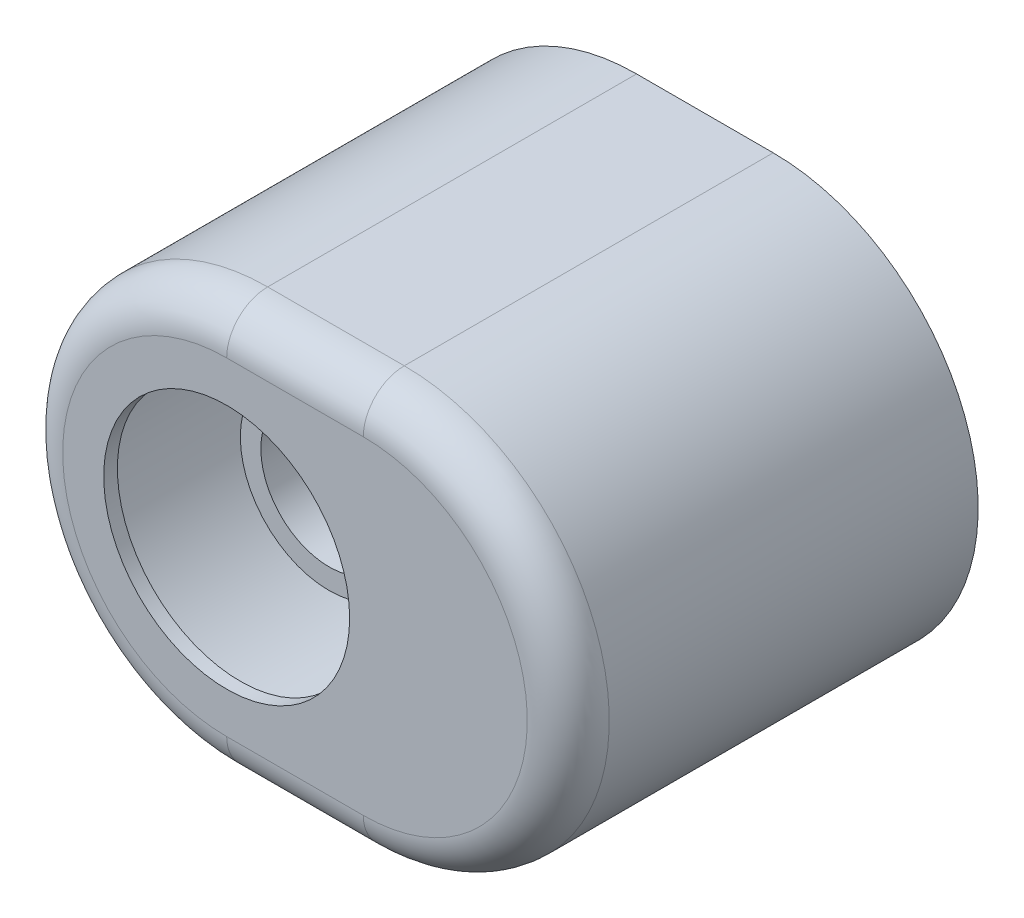
ISO-10303-21;
HEADER;
FILE_DESCRIPTION(('STEP AP214'),'2;1');
FILE_NAME('part.step','',(''),(''),'','','');
FILE_SCHEMA(('AUTOMOTIVE_DESIGN { 1 0 10303 214 1 1 1 1 }'));
ENDSEC;
DATA;
#1=APPLICATION_CONTEXT('core data for automotive mechanical design processes');
#2=APPLICATION_PROTOCOL_DEFINITION('international standard','automotive_design',2000,#1);
#3=PRODUCT_CONTEXT('',#1,'mechanical');
#4=PRODUCT('Part','Part','',(#3));
#5=PRODUCT_RELATED_PRODUCT_CATEGORY('part','',(#4));
#6=PRODUCT_DEFINITION_FORMATION('','',#4);
#7=PRODUCT_DEFINITION_CONTEXT('part definition',#1,'design');
#8=PRODUCT_DEFINITION('design','',#6,#7);
#9=PRODUCT_DEFINITION_SHAPE('','',#8);
#10=(LENGTH_UNIT() NAMED_UNIT(*) SI_UNIT(.MILLI.,.METRE.));
#11=(NAMED_UNIT(*) PLANE_ANGLE_UNIT() SI_UNIT($,.RADIAN.));
#12=(NAMED_UNIT(*) SI_UNIT($,.STERADIAN.) SOLID_ANGLE_UNIT());
#13=UNCERTAINTY_MEASURE_WITH_UNIT(LENGTH_MEASURE(1.E-05),#10,'distance_accuracy_value','');
#14=(GEOMETRIC_REPRESENTATION_CONTEXT(3) GLOBAL_UNCERTAINTY_ASSIGNED_CONTEXT((#13)) GLOBAL_UNIT_ASSIGNED_CONTEXT((#10,
#11,#12)) REPRESENTATION_CONTEXT('',''));
#15=CARTESIAN_POINT('',(0.,0.,0.));
#16=DIRECTION('',(0.,0.,1.));
#17=DIRECTION('',(1.,0.,0.));
#18=AXIS2_PLACEMENT_3D('',#15,#16,#17);
#19=CARTESIAN_POINT('',(-23.,0.,45.));
#20=DIRECTION('',(0.,0.,1.));
#21=DIRECTION('',(1.,0.,0.));
#22=AXIS2_PLACEMENT_3D('',#19,#20,#21);
#23=PLANE('',#22);
#24=CARTESIAN_POINT('',(-10.,0.,45.));
#25=DIRECTION('',(0.,0.,-1.));
#26=DIRECTION('',(-1.,0.,0.));
#27=AXIS2_PLACEMENT_3D('',#24,#25,#26);
#28=CIRCLE('',#27,9.99999999999999);
#29=CARTESIAN_POINT('',(-20.,0.,45.));
#30=VERTEX_POINT('',#29);
#31=EDGE_CURVE('E11',#30,#30,#28,.T.);
#32=ORIENTED_EDGE('',*,*,#31,.T.);
#33=EDGE_LOOP('',(#32));
#34=FACE_BOUND('',#33,.T.);
#35=CARTESIAN_POINT('',(-10.,0.,45.));
#36=DIRECTION('',(0.,0.,-1.));
#37=DIRECTION('',(-1.,0.,0.));
#38=AXIS2_PLACEMENT_3D('',#35,#36,#37);
#39=CIRCLE('',#38,13.);
#40=CARTESIAN_POINT('',(-23.,0.,45.));
#41=VERTEX_POINT('',#40);
#42=EDGE_CURVE('E87',#41,#41,#39,.T.);
#43=ORIENTED_EDGE('',*,*,#42,.F.);
#44=EDGE_LOOP('',(#43));
#45=FACE_BOUND('',#44,.T.);
#46=ADVANCED_FACE('F47',(#34,#45),#23,.T.);
#47=CARTESIAN_POINT('',(-10.,0.,0.));
#48=DIRECTION('',(0.,0.,-1.));
#49=DIRECTION('',(-1.,0.,0.));
#50=AXIS2_PLACEMENT_3D('',#47,#48,#49);
#51=CYLINDRICAL_SURFACE('',#50,9.99999999999999);
#52=CARTESIAN_POINT('',(-10.,0.,39.));
#53=DIRECTION('',(0.,0.,-1.));
#54=DIRECTION('',(-1.,0.,0.));
#55=AXIS2_PLACEMENT_3D('',#52,#53,#54);
#56=CIRCLE('',#55,9.99999999999999);
#57=CARTESIAN_POINT('',(-20.,0.,39.));
#58=VERTEX_POINT('',#57);
#59=EDGE_CURVE('E53',#58,#58,#56,.T.);
#60=ORIENTED_EDGE('',*,*,#59,.T.);
#61=EDGE_LOOP('',(#60));
#62=FACE_BOUND('',#61,.T.);
#63=ORIENTED_EDGE('',*,*,#31,.F.);
#64=EDGE_LOOP('',(#63));
#65=FACE_BOUND('',#64,.T.);
#66=ADVANCED_FACE('F95',(#62,#65),#51,.F.);
#67=CARTESIAN_POINT('',(-20.,0.,39.));
#68=DIRECTION('',(0.,0.,1.));
#69=DIRECTION('',(1.,0.,0.));
#70=AXIS2_PLACEMENT_3D('',#67,#68,#69);
#71=PLANE('',#70);
#72=CARTESIAN_POINT('',(-10.,0.,39.));
#73=DIRECTION('',(0.,0.,-1.));
#74=DIRECTION('',(-1.,0.,0.));
#75=AXIS2_PLACEMENT_3D('',#72,#73,#74);
#76=CIRCLE('',#75,7.99999999999999);
#77=CARTESIAN_POINT('',(-18.,0.,39.));
#78=VERTEX_POINT('',#77);
#79=EDGE_CURVE('E57',#78,#78,#76,.T.);
#80=ORIENTED_EDGE('',*,*,#79,.T.);
#81=EDGE_LOOP('',(#80));
#82=FACE_BOUND('',#81,.T.);
#83=ORIENTED_EDGE('',*,*,#59,.F.);
#84=EDGE_LOOP('',(#83));
#85=FACE_BOUND('',#84,.T.);
#86=ADVANCED_FACE('F99',(#82,#85),#71,.T.);
#87=CARTESIAN_POINT('',(-10.,0.,0.));
#88=DIRECTION('',(0.,0.,-1.));
#89=DIRECTION('',(-1.,0.,0.));
#90=AXIS2_PLACEMENT_3D('',#87,#88,#89);
#91=CYLINDRICAL_SURFACE('',#90,7.99999999999999);
#92=CARTESIAN_POINT('',(-10.,0.,37.));
#93=DIRECTION('',(0.,0.,-1.));
#94=DIRECTION('',(-1.,0.,0.));
#95=AXIS2_PLACEMENT_3D('',#92,#93,#94);
#96=CIRCLE('',#95,7.99999999999999);
#97=CARTESIAN_POINT('',(-18.,0.,37.));
#98=VERTEX_POINT('',#97);
#99=EDGE_CURVE('E61',#98,#98,#96,.T.);
#100=ORIENTED_EDGE('',*,*,#99,.T.);
#101=EDGE_LOOP('',(#100));
#102=FACE_BOUND('',#101,.T.);
#103=ORIENTED_EDGE('',*,*,#79,.F.);
#104=EDGE_LOOP('',(#103));
#105=FACE_BOUND('',#104,.T.);
#106=ADVANCED_FACE('F103',(#102,#105),#91,.F.);
#107=CARTESIAN_POINT('',(-10.,0.,37.));
#108=DIRECTION('',(0.,0.,1.));
#109=DIRECTION('',(1.,0.,0.));
#110=AXIS2_PLACEMENT_3D('',#107,#108,#109);
#111=CONICAL_SURFACE('',#110,7.99999999999999,0.528074448426359);
#112=CARTESIAN_POINT('',(-10.,0.,31.));
#113=DIRECTION('',(0.,0.,-1.));
#114=DIRECTION('',(-1.,0.,0.));
#115=AXIS2_PLACEMENT_3D('',#112,#113,#114);
#116=CIRCLE('',#115,4.5);
#117=CARTESIAN_POINT('',(-14.5,0.,31.));
#118=VERTEX_POINT('',#117);
#119=EDGE_CURVE('E66',#118,#118,#116,.T.);
#120=ORIENTED_EDGE('',*,*,#119,.T.);
#121=EDGE_LOOP('',(#120));
#122=FACE_BOUND('',#121,.T.);
#123=ORIENTED_EDGE('',*,*,#99,.F.);
#124=EDGE_LOOP('',(#123));
#125=FACE_BOUND('',#124,.T.);
#126=ADVANCED_FACE('F110',(#122,#125),#111,.F.);
#127=CARTESIAN_POINT('',(-10.,0.,0.));
#128=DIRECTION('',(0.,0.,-1.));
#129=DIRECTION('',(-1.,0.,0.));
#130=AXIS2_PLACEMENT_3D('',#127,#128,#129);
#131=CYLINDRICAL_SURFACE('',#130,4.5);
#132=CARTESIAN_POINT('',(-10.,0.,29.));
#133=DIRECTION('',(0.,0.,-1.));
#134=DIRECTION('',(-1.,0.,0.));
#135=AXIS2_PLACEMENT_3D('',#132,#133,#134);
#136=CIRCLE('',#135,4.5);
#137=CARTESIAN_POINT('',(-14.5,0.,29.));
#138=VERTEX_POINT('',#137);
#139=EDGE_CURVE('E69',#138,#138,#136,.T.);
#140=ORIENTED_EDGE('',*,*,#139,.T.);
#141=EDGE_LOOP('',(#140));
#142=FACE_BOUND('',#141,.T.);
#143=ORIENTED_EDGE('',*,*,#119,.F.);
#144=EDGE_LOOP('',(#143));
#145=FACE_BOUND('',#144,.T.);
#146=ADVANCED_FACE('F114',(#142,#145),#131,.F.);
#147=CARTESIAN_POINT('',(-14.5,0.,29.));
#148=DIRECTION('',(0.,0.,-1.));
#149=DIRECTION('',(-1.,0.,0.));
#150=AXIS2_PLACEMENT_3D('',#147,#148,#149);
#151=PLANE('',#150);
#152=CARTESIAN_POINT('',(-10.,0.,29.));
#153=DIRECTION('',(0.,0.,-1.));
#154=DIRECTION('',(-1.,0.,0.));
#155=AXIS2_PLACEMENT_3D('',#152,#153,#154);
#156=CIRCLE('',#155,6.5);
#157=CARTESIAN_POINT('',(-16.5,0.,29.));
#158=VERTEX_POINT('',#157);
#159=EDGE_CURVE('E72',#158,#158,#156,.T.);
#160=ORIENTED_EDGE('',*,*,#159,.T.);
#161=EDGE_LOOP('',(#160));
#162=FACE_BOUND('',#161,.T.);
#163=ORIENTED_EDGE('',*,*,#139,.F.);
#164=EDGE_LOOP('',(#163));
#165=FACE_BOUND('',#164,.T.);
#166=ADVANCED_FACE('F118',(#162,#165),#151,.T.);
#167=CARTESIAN_POINT('',(-10.,0.,0.));
#168=DIRECTION('',(0.,0.,-1.));
#169=DIRECTION('',(-1.,0.,0.));
#170=AXIS2_PLACEMENT_3D('',#167,#168,#169);
#171=CYLINDRICAL_SURFACE('',#170,6.5);
#172=CARTESIAN_POINT('',(-10.,0.,25.));
#173=DIRECTION('',(0.,0.,-1.));
#174=DIRECTION('',(-1.,0.,0.));
#175=AXIS2_PLACEMENT_3D('',#172,#173,#174);
#176=CIRCLE('',#175,6.5);
#177=CARTESIAN_POINT('',(-16.5,0.,25.));
#178=VERTEX_POINT('',#177);
#179=EDGE_CURVE('E75',#178,#178,#176,.T.);
#180=ORIENTED_EDGE('',*,*,#179,.T.);
#181=EDGE_LOOP('',(#180));
#182=FACE_BOUND('',#181,.T.);
#183=ORIENTED_EDGE('',*,*,#159,.F.);
#184=EDGE_LOOP('',(#183));
#185=FACE_BOUND('',#184,.T.);
#186=ADVANCED_FACE('F122',(#182,#185),#171,.F.);
#187=CARTESIAN_POINT('',(-16.5,0.,25.));
#188=DIRECTION('',(0.,0.,-1.));
#189=DIRECTION('',(-1.,0.,0.));
#190=AXIS2_PLACEMENT_3D('',#187,#188,#189);
#191=PLANE('',#190);
#192=CARTESIAN_POINT('',(-10.,0.,25.));
#193=DIRECTION('',(0.,0.,-1.));
#194=DIRECTION('',(-1.,0.,0.));
#195=AXIS2_PLACEMENT_3D('',#192,#193,#194);
#196=CIRCLE('',#195,9.49999999999999);
#197=CARTESIAN_POINT('',(-19.5,0.,25.));
#198=VERTEX_POINT('',#197);
#199=EDGE_CURVE('E78',#198,#198,#196,.T.);
#200=ORIENTED_EDGE('',*,*,#199,.T.);
#201=EDGE_LOOP('',(#200));
#202=FACE_BOUND('',#201,.T.);
#203=ORIENTED_EDGE('',*,*,#179,.F.);
#204=EDGE_LOOP('',(#203));
#205=FACE_BOUND('',#204,.T.);
#206=ADVANCED_FACE('F126',(#202,#205),#191,.T.);
#207=CARTESIAN_POINT('',(-10.,0.,0.));
#208=DIRECTION('',(0.,0.,-1.));
#209=DIRECTION('',(-1.,0.,0.));
#210=AXIS2_PLACEMENT_3D('',#207,#208,#209);
#211=CYLINDRICAL_SURFACE('',#210,9.49999999999999);
#212=CARTESIAN_POINT('',(-10.,0.,31.6328891488858));
#213=DIRECTION('',(0.,0.,-1.));
#214=DIRECTION('',(-1.,0.,0.));
#215=AXIS2_PLACEMENT_3D('',#212,#213,#214);
#216=CIRCLE('',#215,9.49999999999999);
#217=CARTESIAN_POINT('',(-19.5,0.,31.6328891488858));
#218=VERTEX_POINT('',#217);
#219=EDGE_CURVE('E81',#218,#218,#216,.T.);
#220=ORIENTED_EDGE('',*,*,#219,.T.);
#221=EDGE_LOOP('',(#220));
#222=FACE_BOUND('',#221,.T.);
#223=ORIENTED_EDGE('',*,*,#199,.F.);
#224=EDGE_LOOP('',(#223));
#225=FACE_BOUND('',#224,.T.);
#226=ADVANCED_FACE('F130',(#222,#225),#211,.T.);
#227=CARTESIAN_POINT('',(-10.,0.,31.6328891488858));
#228=DIRECTION('',(0.,0.,1.));
#229=DIRECTION('',(1.,0.,0.));
#230=AXIS2_PLACEMENT_3D('',#227,#228,#229);
#231=CONICAL_SURFACE('',#230,9.49999999999999,0.528074448426359);
#232=CARTESIAN_POINT('',(-10.,0.,37.6328891488859));
#233=DIRECTION('',(0.,0.,-1.));
#234=DIRECTION('',(-1.,0.,0.));
#235=AXIS2_PLACEMENT_3D('',#232,#233,#234);
#236=CIRCLE('',#235,13.);
#237=CARTESIAN_POINT('',(-23.,0.,37.6328891488859));
#238=VERTEX_POINT('',#237);
#239=EDGE_CURVE('E84',#238,#238,#236,.T.);
#240=ORIENTED_EDGE('',*,*,#239,.T.);
#241=EDGE_LOOP('',(#240));
#242=FACE_BOUND('',#241,.T.);
#243=ORIENTED_EDGE('',*,*,#219,.F.);
#244=EDGE_LOOP('',(#243));
#245=FACE_BOUND('',#244,.T.);
#246=ADVANCED_FACE('F134',(#242,#245),#231,.T.);
#247=CARTESIAN_POINT('',(-10.,0.,0.));
#248=DIRECTION('',(0.,0.,-1.));
#249=DIRECTION('',(-1.,0.,0.));
#250=AXIS2_PLACEMENT_3D('',#247,#248,#249);
#251=CYLINDRICAL_SURFACE('',#250,13.);
#252=ORIENTED_EDGE('',*,*,#42,.T.);
#253=EDGE_LOOP('',(#252));
#254=FACE_BOUND('',#253,.T.);
#255=ORIENTED_EDGE('',*,*,#239,.F.);
#256=EDGE_LOOP('',(#255));
#257=FACE_BOUND('',#256,.T.);
#258=ADVANCED_FACE('F91',(#254,#257),#251,.T.);
#259=CLOSED_SHELL('',(#46,#66,#86,#106,#126,#146,#166,#186,#206,#226,#246,#258));
#260=MANIFOLD_SOLID_BREP('B2',#259);
#261=CARTESIAN_POINT('',(-10.,0.,60.));
#262=DIRECTION('',(0.,0.,-1.));
#263=DIRECTION('',(-1.,0.,0.));
#264=AXIS2_PLACEMENT_3D('',#261,#262,#263);
#265=CYLINDRICAL_SURFACE('',#264,30.);
#266=DIRECTION('',(0.,0.,-1.));
#267=VECTOR('',#266,1.);
#268=CARTESIAN_POINT('',(-10.,-30.,60.));
#269=LINE('',#268,#267);
#270=CARTESIAN_POINT('',(-10.,-30.,54.));
#271=VERTEX_POINT('',#270);
#272=CARTESIAN_POINT('',(-10.,-30.,0.));
#273=VERTEX_POINT('',#272);
#274=EDGE_CURVE('E407',#271,#273,#269,.T.);
#275=ORIENTED_EDGE('',*,*,#274,.F.);
#276=CARTESIAN_POINT('',(-10.,0.,54.));
#277=DIRECTION('',(0.,0.,1.));
#278=DIRECTION('',(1.,0.,0.));
#279=AXIS2_PLACEMENT_3D('',#276,#277,#278);
#280=CIRCLE('',#279,30.);
#281=CARTESIAN_POINT('',(-10.,30.,54.));
#282=VERTEX_POINT('',#281);
#283=EDGE_CURVE('E45',#271,#282,#280,.F.);
#284=ORIENTED_EDGE('',*,*,#283,.T.);
#285=DIRECTION('',(0.,0.,-1.));
#286=VECTOR('',#285,1.);
#287=CARTESIAN_POINT('',(-10.,30.,60.));
#288=LINE('',#287,#286);
#289=CARTESIAN_POINT('',(-10.,30.,0.));
#290=VERTEX_POINT('',#289);
#291=EDGE_CURVE('E398',#282,#290,#288,.T.);
#292=ORIENTED_EDGE('',*,*,#291,.T.);
#293=CARTESIAN_POINT('',(-10.,0.,0.));
#294=DIRECTION('',(0.,0.,1.));
#295=DIRECTION('',(1.,0.,0.));
#296=AXIS2_PLACEMENT_3D('',#293,#294,#295);
#297=CIRCLE('',#296,30.);
#298=EDGE_CURVE('E381',#290,#273,#297,.T.);
#299=ORIENTED_EDGE('',*,*,#298,.T.);
#300=EDGE_LOOP('',(#275,#284,#292,#299));
#301=FACE_BOUND('',#300,.T.);
#302=ADVANCED_FACE('F228',(#301),#265,.T.);
#303=CARTESIAN_POINT('',(-10.,-30.,60.));
#304=DIRECTION('',(0.,1.,0.));
#305=DIRECTION('',(0.,0.,1.));
#306=AXIS2_PLACEMENT_3D('',#303,#304,#305);
#307=PLANE('',#306);
#308=DIRECTION('',(0.,0.,-1.));
#309=VECTOR('',#308,1.);
#310=CARTESIAN_POINT('',(10.,-30.,60.));
#311=LINE('',#310,#309);
#312=CARTESIAN_POINT('',(10.,-30.,54.));
#313=VERTEX_POINT('',#312);
#314=CARTESIAN_POINT('',(10.,-30.,0.));
#315=VERTEX_POINT('',#314);
#316=EDGE_CURVE('E404',#313,#315,#311,.T.);
#317=ORIENTED_EDGE('',*,*,#316,.F.);
#318=DIRECTION('',(1.,0.,0.));
#319=VECTOR('',#318,1.);
#320=CARTESIAN_POINT('',(-10.,-30.,54.));
#321=LINE('',#320,#319);
#322=EDGE_CURVE('E238',#313,#271,#321,.F.);
#323=ORIENTED_EDGE('',*,*,#322,.T.);
#324=ORIENTED_EDGE('',*,*,#274,.T.);
#325=DIRECTION('',(1.,0.,0.));
#326=VECTOR('',#325,1.);
#327=CARTESIAN_POINT('',(-10.,-30.,0.));
#328=LINE('',#327,#326);
#329=EDGE_CURVE('E385',#273,#315,#328,.T.);
#330=ORIENTED_EDGE('',*,*,#329,.T.);
#331=EDGE_LOOP('',(#317,#323,#324,#330));
#332=FACE_BOUND('',#331,.T.);
#333=ADVANCED_FACE('F484',(#332),#307,.F.);
#334=CARTESIAN_POINT('',(10.,0.,60.));
#335=DIRECTION('',(0.,0.,-1.));
#336=DIRECTION('',(-1.,0.,0.));
#337=AXIS2_PLACEMENT_3D('',#334,#335,#336);
#338=CYLINDRICAL_SURFACE('',#337,30.);
#339=DIRECTION('',(0.,0.,-1.));
#340=VECTOR('',#339,1.);
#341=CARTESIAN_POINT('',(10.,30.,60.));
#342=LINE('',#341,#340);
#343=CARTESIAN_POINT('',(10.,30.,54.));
#344=VERTEX_POINT('',#343);
#345=CARTESIAN_POINT('',(10.,30.,0.));
#346=VERTEX_POINT('',#345);
#347=EDGE_CURVE('E401',#344,#346,#342,.T.);
#348=ORIENTED_EDGE('',*,*,#347,.F.);
#349=CARTESIAN_POINT('',(10.,0.,54.));
#350=DIRECTION('',(0.,0.,1.));
#351=DIRECTION('',(1.,0.,0.));
#352=AXIS2_PLACEMENT_3D('',#349,#350,#351);
#353=CIRCLE('',#352,30.);
#354=EDGE_CURVE('E427',#344,#313,#353,.F.);
#355=ORIENTED_EDGE('',*,*,#354,.T.);
#356=ORIENTED_EDGE('',*,*,#316,.T.);
#357=CARTESIAN_POINT('',(10.,0.,0.));
#358=DIRECTION('',(0.,0.,1.));
#359=DIRECTION('',(1.,0.,0.));
#360=AXIS2_PLACEMENT_3D('',#357,#358,#359);
#361=CIRCLE('',#360,30.);
#362=EDGE_CURVE('E390',#315,#346,#361,.T.);
#363=ORIENTED_EDGE('',*,*,#362,.T.);
#364=EDGE_LOOP('',(#348,#355,#356,#363));
#365=FACE_BOUND('',#364,.T.);
#366=ADVANCED_FACE('F479',(#365),#338,.T.);
#367=CARTESIAN_POINT('',(-10.,30.,60.));
#368=DIRECTION('',(0.,-1.,0.));
#369=DIRECTION('',(1.,0.,0.));
#370=AXIS2_PLACEMENT_3D('',#367,#368,#369);
#371=PLANE('',#370);
#372=ORIENTED_EDGE('',*,*,#291,.F.);
#373=DIRECTION('',(-1.,0.,0.));
#374=VECTOR('',#373,1.);
#375=CARTESIAN_POINT('',(10.,30.,54.));
#376=LINE('',#375,#374);
#377=EDGE_CURVE('E423',#282,#344,#376,.F.);
#378=ORIENTED_EDGE('',*,*,#377,.T.);
#379=ORIENTED_EDGE('',*,*,#347,.T.);
#380=DIRECTION('',(-1.,0.,0.));
#381=VECTOR('',#380,1.);
#382=CARTESIAN_POINT('',(-10.,30.,0.));
#383=LINE('',#382,#381);
#384=EDGE_CURVE('E394',#346,#290,#383,.T.);
#385=ORIENTED_EDGE('',*,*,#384,.T.);
#386=EDGE_LOOP('',(#372,#378,#379,#385));
#387=FACE_BOUND('',#386,.T.);
#388=ADVANCED_FACE('F460',(#387),#371,.F.);
#389=CARTESIAN_POINT('',(-10.,0.,60.));
#390=DIRECTION('',(0.,0.,1.));
#391=DIRECTION('',(1.,0.,0.));
#392=AXIS2_PLACEMENT_3D('',#389,#390,#391);
#393=PLANE('',#392);
#394=CARTESIAN_POINT('',(-10.,0.,60.));
#395=DIRECTION('',(0.,0.,1.));
#396=DIRECTION('',(1.,0.,0.));
#397=AXIS2_PLACEMENT_3D('',#394,#395,#396);
#398=CIRCLE('',#397,18.);
#399=CARTESIAN_POINT('',(7.99999999999999,0.,60.));
#400=VERTEX_POINT('',#399);
#401=EDGE_CURVE('E366',#400,#400,#398,.T.);
#402=ORIENTED_EDGE('',*,*,#401,.F.);
#403=EDGE_LOOP('',(#402));
#404=FACE_BOUND('',#403,.T.);
#405=CARTESIAN_POINT('',(10.,0.,60.));
#406=DIRECTION('',(0.,0.,1.));
#407=DIRECTION('',(1.,0.,0.));
#408=AXIS2_PLACEMENT_3D('',#405,#406,#407);
#409=CIRCLE('',#408,24.);
#410=CARTESIAN_POINT('',(10.,-24.,60.));
#411=VERTEX_POINT('',#410);
#412=CARTESIAN_POINT('',(10.,24.,60.));
#413=VERTEX_POINT('',#412);
#414=EDGE_CURVE('E416',#411,#413,#409,.T.);
#415=ORIENTED_EDGE('',*,*,#414,.T.);
#416=DIRECTION('',(-1.,0.,0.));
#417=VECTOR('',#416,1.);
#418=CARTESIAN_POINT('',(-10.,24.,60.));
#419=LINE('',#418,#417);
#420=CARTESIAN_POINT('',(-10.,24.,60.));
#421=VERTEX_POINT('',#420);
#422=EDGE_CURVE('E419',#413,#421,#419,.T.);
#423=ORIENTED_EDGE('',*,*,#422,.T.);
#424=CARTESIAN_POINT('',(-10.,0.,60.));
#425=DIRECTION('',(0.,0.,1.));
#426=DIRECTION('',(1.,0.,0.));
#427=AXIS2_PLACEMENT_3D('',#424,#425,#426);
#428=CIRCLE('',#427,24.);
#429=CARTESIAN_POINT('',(-10.,-24.,60.));
#430=VERTEX_POINT('',#429);
#431=EDGE_CURVE('E410',#421,#430,#428,.T.);
#432=ORIENTED_EDGE('',*,*,#431,.T.);
#433=DIRECTION('',(1.,0.,0.));
#434=VECTOR('',#433,1.);
#435=CARTESIAN_POINT('',(10.,-24.,60.));
#436=LINE('',#435,#434);
#437=EDGE_CURVE('E413',#430,#411,#436,.T.);
#438=ORIENTED_EDGE('',*,*,#437,.T.);
#439=EDGE_LOOP('',(#415,#423,#432,#438));
#440=FACE_BOUND('',#439,.T.);
#441=ADVANCED_FACE('F468',(#404,#440),#393,.T.);
#442=CARTESIAN_POINT('',(-10.,0.,0.));
#443=DIRECTION('',(0.,0.,1.));
#444=DIRECTION('',(1.,0.,0.));
#445=AXIS2_PLACEMENT_3D('',#442,#443,#444);
#446=PLANE('',#445);
#447=DIRECTION('',(-1.,0.,0.));
#448=VECTOR('',#447,1.);
#449=CARTESIAN_POINT('',(-10.,28.,0.));
#450=LINE('',#449,#448);
#451=CARTESIAN_POINT('',(10.,28.,0.));
#452=VERTEX_POINT('',#451);
#453=CARTESIAN_POINT('',(-10.,28.,0.));
#454=VERTEX_POINT('',#453);
#455=EDGE_CURVE('E344',#452,#454,#450,.T.);
#456=ORIENTED_EDGE('',*,*,#455,.T.);
#457=CARTESIAN_POINT('',(-10.,0.,0.));
#458=DIRECTION('',(0.,0.,1.));
#459=DIRECTION('',(1.,0.,0.));
#460=AXIS2_PLACEMENT_3D('',#457,#458,#459);
#461=CIRCLE('',#460,28.);
#462=CARTESIAN_POINT('',(-10.,-28.,0.));
#463=VERTEX_POINT('',#462);
#464=EDGE_CURVE('E338',#454,#463,#461,.T.);
#465=ORIENTED_EDGE('',*,*,#464,.T.);
#466=DIRECTION('',(1.,0.,0.));
#467=VECTOR('',#466,1.);
#468=CARTESIAN_POINT('',(-10.,-28.,0.));
#469=LINE('',#468,#467);
#470=CARTESIAN_POINT('',(10.,-28.,0.));
#471=VERTEX_POINT('',#470);
#472=EDGE_CURVE('E372',#463,#471,#469,.T.);
#473=ORIENTED_EDGE('',*,*,#472,.T.);
#474=CARTESIAN_POINT('',(10.,0.,0.));
#475=DIRECTION('',(0.,0.,1.));
#476=DIRECTION('',(1.,0.,0.));
#477=AXIS2_PLACEMENT_3D('',#474,#475,#476);
#478=CIRCLE('',#477,28.);
#479=EDGE_CURVE('E246',#471,#452,#478,.T.);
#480=ORIENTED_EDGE('',*,*,#479,.T.);
#481=EDGE_LOOP('',(#456,#465,#473,#480));
#482=FACE_BOUND('',#481,.T.);
#483=ORIENTED_EDGE('',*,*,#298,.F.);
#484=ORIENTED_EDGE('',*,*,#384,.F.);
#485=ORIENTED_EDGE('',*,*,#362,.F.);
#486=ORIENTED_EDGE('',*,*,#329,.F.);
#487=EDGE_LOOP('',(#483,#484,#485,#486));
#488=FACE_BOUND('',#487,.T.);
#489=ADVANCED_FACE('F470',(#482,#488),#446,.F.);
#490=CARTESIAN_POINT('',(-10.,-24.,54.));
#491=DIRECTION('',(-1.,0.,0.));
#492=DIRECTION('',(0.,0.,1.));
#493=AXIS2_PLACEMENT_3D('',#490,#491,#492);
#494=CYLINDRICAL_SURFACE('',#493,6.);
#495=CARTESIAN_POINT('',(-10.,-24.,54.));
#496=DIRECTION('',(-1.,0.,0.));
#497=DIRECTION('',(0.,0.,1.));
#498=AXIS2_PLACEMENT_3D('',#495,#496,#497);
#499=CIRCLE('',#498,6.);
#500=EDGE_CURVE('E437',#271,#430,#499,.T.);
#501=ORIENTED_EDGE('',*,*,#500,.F.);
#502=ORIENTED_EDGE('',*,*,#322,.F.);
#503=CARTESIAN_POINT('',(10.,-24.,54.));
#504=DIRECTION('',(1.,0.,0.));
#505=DIRECTION('',(0.,1.,0.));
#506=AXIS2_PLACEMENT_3D('',#503,#504,#505);
#507=CIRCLE('',#506,6.);
#508=EDGE_CURVE('E386',#411,#313,#507,.T.);
#509=ORIENTED_EDGE('',*,*,#508,.F.);
#510=ORIENTED_EDGE('',*,*,#437,.F.);
#511=EDGE_LOOP('',(#501,#502,#509,#510));
#512=FACE_BOUND('',#511,.T.);
#513=ADVANCED_FACE('F230',(#512),#494,.T.);
#514=CARTESIAN_POINT('',(10.,0.,54.));
#515=DIRECTION('',(0.,0.,1.));
#516=DIRECTION('',(1.,0.,0.));
#517=AXIS2_PLACEMENT_3D('',#514,#515,#516);
#518=TOROIDAL_SURFACE('',#517,24.,6.);
#519=ORIENTED_EDGE('',*,*,#508,.T.);
#520=ORIENTED_EDGE('',*,*,#354,.F.);
#521=CARTESIAN_POINT('',(10.,24.,54.));
#522=DIRECTION('',(-1.,0.,0.));
#523=DIRECTION('',(0.,-1.,0.));
#524=AXIS2_PLACEMENT_3D('',#521,#522,#523);
#525=CIRCLE('',#524,6.);
#526=EDGE_CURVE('E434',#413,#344,#525,.T.);
#527=ORIENTED_EDGE('',*,*,#526,.F.);
#528=ORIENTED_EDGE('',*,*,#414,.F.);
#529=EDGE_LOOP('',(#519,#520,#527,#528));
#530=FACE_BOUND('',#529,.T.);
#531=ADVANCED_FACE('F446',(#530),#518,.T.);
#532=CARTESIAN_POINT('',(-10.,0.,54.));
#533=DIRECTION('',(0.,0.,1.));
#534=DIRECTION('',(1.,0.,0.));
#535=AXIS2_PLACEMENT_3D('',#532,#533,#534);
#536=TOROIDAL_SURFACE('',#535,24.,6.);
#537=ORIENTED_EDGE('',*,*,#500,.T.);
#538=ORIENTED_EDGE('',*,*,#431,.F.);
#539=CARTESIAN_POINT('',(-10.,24.,54.));
#540=DIRECTION('',(1.,0.,0.));
#541=DIRECTION('',(0.,0.,-1.));
#542=AXIS2_PLACEMENT_3D('',#539,#540,#541);
#543=CIRCLE('',#542,6.);
#544=EDGE_CURVE('E330',#282,#421,#543,.T.);
#545=ORIENTED_EDGE('',*,*,#544,.F.);
#546=ORIENTED_EDGE('',*,*,#283,.F.);
#547=EDGE_LOOP('',(#537,#538,#545,#546));
#548=FACE_BOUND('',#547,.T.);
#549=ADVANCED_FACE('F455',(#548),#536,.T.);
#550=CARTESIAN_POINT('',(-10.,24.,54.));
#551=DIRECTION('',(1.,0.,0.));
#552=DIRECTION('',(0.,1.,0.));
#553=AXIS2_PLACEMENT_3D('',#550,#551,#552);
#554=CYLINDRICAL_SURFACE('',#553,6.);
#555=ORIENTED_EDGE('',*,*,#526,.T.);
#556=ORIENTED_EDGE('',*,*,#377,.F.);
#557=ORIENTED_EDGE('',*,*,#544,.T.);
#558=ORIENTED_EDGE('',*,*,#422,.F.);
#559=EDGE_LOOP('',(#555,#556,#557,#558));
#560=FACE_BOUND('',#559,.T.);
#561=ADVANCED_FACE('F465',(#560),#554,.T.);
#562=CARTESIAN_POINT('',(-10.,0.,60.));
#563=DIRECTION('',(0.,0.,-1.));
#564=DIRECTION('',(-1.,0.,0.));
#565=AXIS2_PLACEMENT_3D('',#562,#563,#564);
#566=CYLINDRICAL_SURFACE('',#565,28.);
#567=DIRECTION('',(0.,0.,1.));
#568=VECTOR('',#567,1.);
#569=CARTESIAN_POINT('',(-10.,-28.,60.));
#570=LINE('',#569,#568);
#571=CARTESIAN_POINT('',(-10.,-28.,54.));
#572=VERTEX_POINT('',#571);
#573=EDGE_CURVE('E627',#572,#463,#570,.F.);
#574=ORIENTED_EDGE('',*,*,#573,.T.);
#575=ORIENTED_EDGE('',*,*,#464,.F.);
#576=DIRECTION('',(0.,0.,-1.));
#577=VECTOR('',#576,1.);
#578=CARTESIAN_POINT('',(-10.,28.,60.));
#579=LINE('',#578,#577);
#580=CARTESIAN_POINT('',(-10.,28.,54.));
#581=VERTEX_POINT('',#580);
#582=EDGE_CURVE('E334',#581,#454,#579,.T.);
#583=ORIENTED_EDGE('',*,*,#582,.F.);
#584=CARTESIAN_POINT('',(-10.,0.,54.));
#585=DIRECTION('',(0.,0.,-1.));
#586=DIRECTION('',(-1.,0.,0.));
#587=AXIS2_PLACEMENT_3D('',#584,#585,#586);
#588=CIRCLE('',#587,28.);
#589=EDGE_CURVE('E320',#572,#581,#588,.T.);
#590=ORIENTED_EDGE('',*,*,#589,.F.);
#591=EDGE_LOOP('',(#574,#575,#583,#590));
#592=FACE_BOUND('',#591,.T.);
#593=ADVANCED_FACE('F336',(#592),#566,.F.);
#594=CARTESIAN_POINT('',(-10.,-28.,60.));
#595=DIRECTION('',(0.,1.,0.));
#596=DIRECTION('',(0.,0.,1.));
#597=AXIS2_PLACEMENT_3D('',#594,#595,#596);
#598=PLANE('',#597);
#599=DIRECTION('',(0.,0.,-1.));
#600=VECTOR('',#599,1.);
#601=CARTESIAN_POINT('',(10.,-28.,60.));
#602=LINE('',#601,#600);
#603=CARTESIAN_POINT('',(10.,-28.,54.));
#604=VERTEX_POINT('',#603);
#605=EDGE_CURVE('E629',#604,#471,#602,.T.);
#606=ORIENTED_EDGE('',*,*,#605,.T.);
#607=ORIENTED_EDGE('',*,*,#472,.F.);
#608=ORIENTED_EDGE('',*,*,#573,.F.);
#609=DIRECTION('',(1.,0.,0.));
#610=VECTOR('',#609,1.);
#611=CARTESIAN_POINT('',(-10.,-28.,54.));
#612=LINE('',#611,#610);
#613=EDGE_CURVE('E331',#604,#572,#612,.F.);
#614=ORIENTED_EDGE('',*,*,#613,.F.);
#615=EDGE_LOOP('',(#606,#607,#608,#614));
#616=FACE_BOUND('',#615,.T.);
#617=ADVANCED_FACE('F520',(#616),#598,.T.);
#618=CARTESIAN_POINT('',(10.,0.,60.));
#619=DIRECTION('',(0.,0.,-1.));
#620=DIRECTION('',(-1.,0.,0.));
#621=AXIS2_PLACEMENT_3D('',#618,#619,#620);
#622=CYLINDRICAL_SURFACE('',#621,28.);
#623=DIRECTION('',(0.,0.,1.));
#624=VECTOR('',#623,1.);
#625=CARTESIAN_POINT('',(10.,28.,60.));
#626=LINE('',#625,#624);
#627=CARTESIAN_POINT('',(10.,28.,54.));
#628=VERTEX_POINT('',#627);
#629=EDGE_CURVE('E343',#628,#452,#626,.F.);
#630=ORIENTED_EDGE('',*,*,#629,.T.);
#631=ORIENTED_EDGE('',*,*,#479,.F.);
#632=ORIENTED_EDGE('',*,*,#605,.F.);
#633=CARTESIAN_POINT('',(10.,0.,54.));
#634=DIRECTION('',(0.,0.,-1.));
#635=DIRECTION('',(-1.,0.,0.));
#636=AXIS2_PLACEMENT_3D('',#633,#634,#635);
#637=CIRCLE('',#636,28.);
#638=EDGE_CURVE('E353',#628,#604,#637,.T.);
#639=ORIENTED_EDGE('',*,*,#638,.F.);
#640=EDGE_LOOP('',(#630,#631,#632,#639));
#641=FACE_BOUND('',#640,.T.);
#642=ADVANCED_FACE('F529',(#641),#622,.F.);
#643=CARTESIAN_POINT('',(-10.,28.,60.));
#644=DIRECTION('',(0.,-1.,0.));
#645=DIRECTION('',(1.,0.,0.));
#646=AXIS2_PLACEMENT_3D('',#643,#644,#645);
#647=PLANE('',#646);
#648=ORIENTED_EDGE('',*,*,#582,.T.);
#649=ORIENTED_EDGE('',*,*,#455,.F.);
#650=ORIENTED_EDGE('',*,*,#629,.F.);
#651=DIRECTION('',(1.,0.,0.));
#652=VECTOR('',#651,1.);
#653=CARTESIAN_POINT('',(-10.,28.,54.));
#654=LINE('',#653,#652);
#655=EDGE_CURVE('E348',#581,#628,#654,.T.);
#656=ORIENTED_EDGE('',*,*,#655,.F.);
#657=EDGE_LOOP('',(#648,#649,#650,#656));
#658=FACE_BOUND('',#657,.T.);
#659=ADVANCED_FACE('F349',(#658),#647,.T.);
#660=CARTESIAN_POINT('',(-10.,0.,58.));
#661=DIRECTION('',(0.,0.,1.));
#662=DIRECTION('',(1.,0.,0.));
#663=AXIS2_PLACEMENT_3D('',#660,#661,#662);
#664=PLANE('',#663);
#665=CARTESIAN_POINT('',(-10.,0.,58.));
#666=DIRECTION('',(0.,0.,1.));
#667=DIRECTION('',(1.,0.,0.));
#668=AXIS2_PLACEMENT_3D('',#665,#666,#667);
#669=CIRCLE('',#668,18.);
#670=CARTESIAN_POINT('',(7.99999999999999,0.,58.));
#671=VERTEX_POINT('',#670);
#672=EDGE_CURVE('E232',#671,#671,#669,.T.);
#673=ORIENTED_EDGE('',*,*,#672,.T.);
#674=EDGE_LOOP('',(#673));
#675=FACE_BOUND('',#674,.T.);
#676=CARTESIAN_POINT('',(10.,0.,58.));
#677=DIRECTION('',(0.,0.,1.));
#678=DIRECTION('',(1.,0.,0.));
#679=AXIS2_PLACEMENT_3D('',#676,#677,#678);
#680=CIRCLE('',#679,24.);
#681=CARTESIAN_POINT('',(10.,-24.,58.));
#682=VERTEX_POINT('',#681);
#683=CARTESIAN_POINT('',(10.,24.,58.));
#684=VERTEX_POINT('',#683);
#685=EDGE_CURVE('E615',#682,#684,#680,.T.);
#686=ORIENTED_EDGE('',*,*,#685,.F.);
#687=DIRECTION('',(1.,0.,0.));
#688=VECTOR('',#687,1.);
#689=CARTESIAN_POINT('',(-10.,-24.,58.));
#690=LINE('',#689,#688);
#691=CARTESIAN_POINT('',(-10.,-24.,58.));
#692=VERTEX_POINT('',#691);
#693=EDGE_CURVE('E616',#692,#682,#690,.T.);
#694=ORIENTED_EDGE('',*,*,#693,.F.);
#695=CARTESIAN_POINT('',(-10.,0.,58.));
#696=DIRECTION('',(0.,0.,1.));
#697=DIRECTION('',(1.,0.,0.));
#698=AXIS2_PLACEMENT_3D('',#695,#696,#697);
#699=CIRCLE('',#698,24.);
#700=CARTESIAN_POINT('',(-10.,24.,58.));
#701=VERTEX_POINT('',#700);
#702=EDGE_CURVE('E623',#701,#692,#699,.T.);
#703=ORIENTED_EDGE('',*,*,#702,.F.);
#704=DIRECTION('',(1.,0.,0.));
#705=VECTOR('',#704,1.);
#706=CARTESIAN_POINT('',(-10.,24.,58.));
#707=LINE('',#706,#705);
#708=EDGE_CURVE('E354',#684,#701,#707,.F.);
#709=ORIENTED_EDGE('',*,*,#708,.F.);
#710=EDGE_LOOP('',(#686,#694,#703,#709));
#711=FACE_BOUND('',#710,.T.);
#712=ADVANCED_FACE('F547',(#675,#711),#664,.F.);
#713=CARTESIAN_POINT('',(-10.,-24.,54.));
#714=DIRECTION('',(-1.,0.,0.));
#715=DIRECTION('',(0.,0.,1.));
#716=AXIS2_PLACEMENT_3D('',#713,#714,#715);
#717=CYLINDRICAL_SURFACE('',#716,4.);
#718=CARTESIAN_POINT('',(-10.,-24.,54.));
#719=DIRECTION('',(-1.,0.,0.));
#720=DIRECTION('',(0.,-1.,0.));
#721=AXIS2_PLACEMENT_3D('',#718,#719,#720);
#722=CIRCLE('',#721,4.);
#723=EDGE_CURVE('E327',#572,#692,#722,.T.);
#724=ORIENTED_EDGE('',*,*,#723,.T.);
#725=ORIENTED_EDGE('',*,*,#693,.T.);
#726=CARTESIAN_POINT('',(10.,-24.,54.));
#727=DIRECTION('',(-1.,0.,0.));
#728=DIRECTION('',(0.,-1.,0.));
#729=AXIS2_PLACEMENT_3D('',#726,#727,#728);
#730=CIRCLE('',#729,4.);
#731=EDGE_CURVE('E373',#682,#604,#730,.F.);
#732=ORIENTED_EDGE('',*,*,#731,.T.);
#733=ORIENTED_EDGE('',*,*,#613,.T.);
#734=EDGE_LOOP('',(#724,#725,#732,#733));
#735=FACE_BOUND('',#734,.T.);
#736=ADVANCED_FACE('F554',(#735),#717,.F.);
#737=CARTESIAN_POINT('',(10.,0.,54.));
#738=DIRECTION('',(0.,0.,1.));
#739=DIRECTION('',(1.,0.,0.));
#740=AXIS2_PLACEMENT_3D('',#737,#738,#739);
#741=TOROIDAL_SURFACE('',#740,24.,4.);
#742=ORIENTED_EDGE('',*,*,#731,.F.);
#743=ORIENTED_EDGE('',*,*,#685,.T.);
#744=CARTESIAN_POINT('',(10.,24.,54.));
#745=DIRECTION('',(1.,0.,0.));
#746=DIRECTION('',(0.,1.,0.));
#747=AXIS2_PLACEMENT_3D('',#744,#745,#746);
#748=CIRCLE('',#747,4.);
#749=EDGE_CURVE('E360',#684,#628,#748,.F.);
#750=ORIENTED_EDGE('',*,*,#749,.T.);
#751=ORIENTED_EDGE('',*,*,#638,.T.);
#752=EDGE_LOOP('',(#742,#743,#750,#751));
#753=FACE_BOUND('',#752,.T.);
#754=ADVANCED_FACE('F559',(#753),#741,.F.);
#755=CARTESIAN_POINT('',(-10.,0.,54.));
#756=DIRECTION('',(0.,0.,1.));
#757=DIRECTION('',(1.,0.,0.));
#758=AXIS2_PLACEMENT_3D('',#755,#756,#757);
#759=TOROIDAL_SURFACE('',#758,24.,4.);
#760=ORIENTED_EDGE('',*,*,#723,.F.);
#761=ORIENTED_EDGE('',*,*,#589,.T.);
#762=CARTESIAN_POINT('',(-10.,24.,54.));
#763=DIRECTION('',(1.,0.,0.));
#764=DIRECTION('',(0.,1.,0.));
#765=AXIS2_PLACEMENT_3D('',#762,#763,#764);
#766=CIRCLE('',#765,4.);
#767=EDGE_CURVE('E324',#581,#701,#766,.T.);
#768=ORIENTED_EDGE('',*,*,#767,.T.);
#769=ORIENTED_EDGE('',*,*,#702,.T.);
#770=EDGE_LOOP('',(#760,#761,#768,#769));
#771=FACE_BOUND('',#770,.T.);
#772=ADVANCED_FACE('F322',(#771),#759,.F.);
#773=CARTESIAN_POINT('',(-10.,24.,54.));
#774=DIRECTION('',(1.,0.,0.));
#775=DIRECTION('',(0.,1.,0.));
#776=AXIS2_PLACEMENT_3D('',#773,#774,#775);
#777=CYLINDRICAL_SURFACE('',#776,4.);
#778=ORIENTED_EDGE('',*,*,#749,.F.);
#779=ORIENTED_EDGE('',*,*,#708,.T.);
#780=ORIENTED_EDGE('',*,*,#767,.F.);
#781=ORIENTED_EDGE('',*,*,#655,.T.);
#782=EDGE_LOOP('',(#778,#779,#780,#781));
#783=FACE_BOUND('',#782,.T.);
#784=ADVANCED_FACE('F357',(#783),#777,.F.);
#785=CARTESIAN_POINT('',(-10.,0.,0.));
#786=DIRECTION('',(0.,0.,1.));
#787=DIRECTION('',(1.,0.,0.));
#788=AXIS2_PLACEMENT_3D('',#785,#786,#787);
#789=CYLINDRICAL_SURFACE('',#788,18.);
#790=ORIENTED_EDGE('',*,*,#401,.T.);
#791=EDGE_LOOP('',(#790));
#792=FACE_BOUND('',#791,.T.);
#793=ORIENTED_EDGE('',*,*,#672,.F.);
#794=EDGE_LOOP('',(#793));
#795=FACE_BOUND('',#794,.T.);
#796=ADVANCED_FACE('F585',(#792,#795),#789,.F.);
#797=CLOSED_SHELL('',(#302,#333,#366,#388,#441,#489,#513,#531,#549,#561,#593,#617,#642,#659,
#712,#736,#754,#772,#784,#796));
#798=MANIFOLD_SOLID_BREP('B6',#797);
#799=ADVANCED_BREP_SHAPE_REPRESENTATION('',(#18,#260,#798),#14);
#800=SHAPE_DEFINITION_REPRESENTATION(#9,#799);
ENDSEC;
END-ISO-10303-21;
